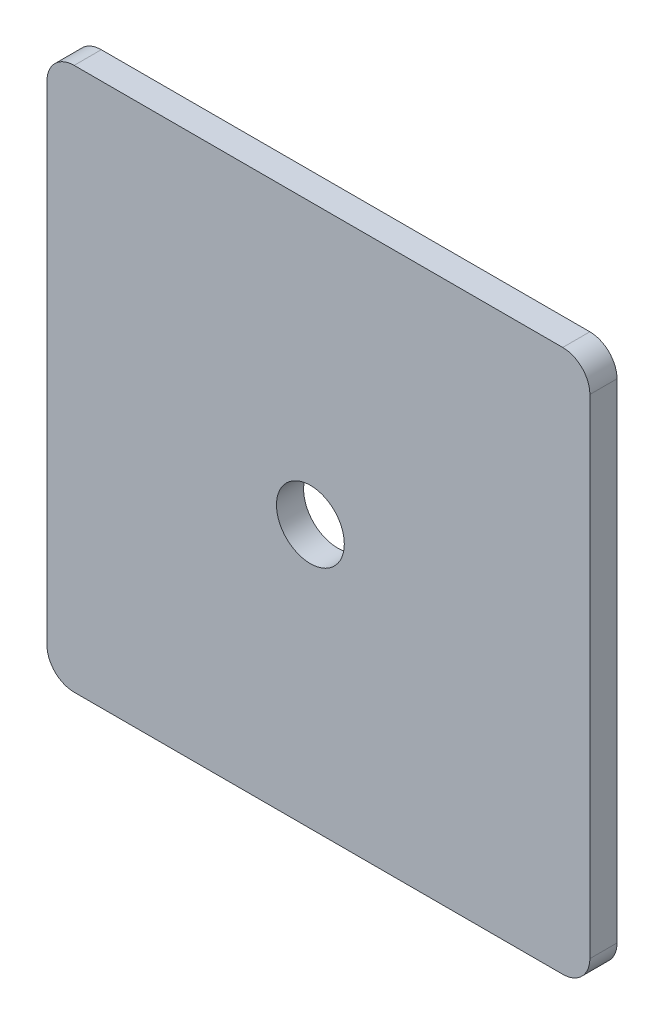
ISO-10303-21;
HEADER;
FILE_DESCRIPTION(('STEP AP214'),'2;1');
FILE_NAME('part.step','',(''),(''),'','','');
FILE_SCHEMA(('AUTOMOTIVE_DESIGN { 1 0 10303 214 1 1 1 1 }'));
ENDSEC;
DATA;
#1=APPLICATION_CONTEXT('core data for automotive mechanical design processes');
#2=APPLICATION_PROTOCOL_DEFINITION('international standard','automotive_design',2000,#1);
#3=PRODUCT_CONTEXT('',#1,'mechanical');
#4=PRODUCT('Part','Part','',(#3));
#5=PRODUCT_RELATED_PRODUCT_CATEGORY('part','',(#4));
#6=PRODUCT_DEFINITION_FORMATION('','',#4);
#7=PRODUCT_DEFINITION_CONTEXT('part definition',#1,'design');
#8=PRODUCT_DEFINITION('design','',#6,#7);
#9=PRODUCT_DEFINITION_SHAPE('','',#8);
#10=(LENGTH_UNIT() NAMED_UNIT(*) SI_UNIT(.MILLI.,.METRE.));
#11=(NAMED_UNIT(*) PLANE_ANGLE_UNIT() SI_UNIT($,.RADIAN.));
#12=(NAMED_UNIT(*) SI_UNIT($,.STERADIAN.) SOLID_ANGLE_UNIT());
#13=UNCERTAINTY_MEASURE_WITH_UNIT(LENGTH_MEASURE(1.E-05),#10,'distance_accuracy_value','');
#14=(GEOMETRIC_REPRESENTATION_CONTEXT(3) GLOBAL_UNCERTAINTY_ASSIGNED_CONTEXT((#13)) GLOBAL_UNIT_ASSIGNED_CONTEXT((#10,
#11,#12)) REPRESENTATION_CONTEXT('',''));
#15=CARTESIAN_POINT('',(0.,0.,0.));
#16=DIRECTION('',(0.,0.,1.));
#17=DIRECTION('',(1.,0.,0.));
#18=AXIS2_PLACEMENT_3D('',#15,#16,#17);
#19=CARTESIAN_POINT('',(-90.,-90.,10.));
#20=DIRECTION('',(0.,0.,-1.));
#21=DIRECTION('',(-1.,0.,0.));
#22=AXIS2_PLACEMENT_3D('',#19,#20,#21);
#23=PLANE('',#22);
#24=CARTESIAN_POINT('',(-90.,-90.,10.));
#25=DIRECTION('',(0.,0.,1.));
#26=DIRECTION('',(-1.,0.,0.));
#27=AXIS2_PLACEMENT_3D('',#24,#25,#26);
#28=CIRCLE('',#27,9.99999999999999);
#29=CARTESIAN_POINT('',(-100.,-89.9999999999999,10.));
#30=VERTEX_POINT('',#29);
#31=CARTESIAN_POINT('',(-89.9999999999999,-100.,10.));
#32=VERTEX_POINT('',#31);
#33=EDGE_CURVE('E145',#30,#32,#28,.T.);
#34=ORIENTED_EDGE('',*,*,#33,.T.);
#35=DIRECTION('',(1.,0.,0.));
#36=VECTOR('',#35,1.);
#37=CARTESIAN_POINT('',(-89.9999999999999,-100.,10.));
#38=LINE('',#37,#36);
#39=CARTESIAN_POINT('',(89.9999999999999,-100.,10.));
#40=VERTEX_POINT('',#39);
#41=EDGE_CURVE('E93',#32,#40,#38,.T.);
#42=ORIENTED_EDGE('',*,*,#41,.T.);
#43=CARTESIAN_POINT('',(90.,-90.,10.));
#44=DIRECTION('',(0.,0.,1.));
#45=DIRECTION('',(1.,0.,0.));
#46=AXIS2_PLACEMENT_3D('',#43,#44,#45);
#47=CIRCLE('',#46,9.99999999999999);
#48=CARTESIAN_POINT('',(100.,-89.9999999999999,10.));
#49=VERTEX_POINT('',#48);
#50=EDGE_CURVE('E160',#40,#49,#47,.T.);
#51=ORIENTED_EDGE('',*,*,#50,.T.);
#52=DIRECTION('',(0.,1.,0.));
#53=VECTOR('',#52,1.);
#54=CARTESIAN_POINT('',(100.,-89.9999999999999,10.));
#55=LINE('',#54,#53);
#56=CARTESIAN_POINT('',(100.,89.9999999999999,10.));
#57=VERTEX_POINT('',#56);
#58=EDGE_CURVE('E173',#49,#57,#55,.T.);
#59=ORIENTED_EDGE('',*,*,#58,.T.);
#60=CARTESIAN_POINT('',(90.,90.,10.));
#61=DIRECTION('',(0.,0.,1.));
#62=DIRECTION('',(1.,0.,0.));
#63=AXIS2_PLACEMENT_3D('',#60,#61,#62);
#64=CIRCLE('',#63,9.99999999999999);
#65=CARTESIAN_POINT('',(89.9999999999999,100.,10.));
#66=VERTEX_POINT('',#65);
#67=EDGE_CURVE('E112',#57,#66,#64,.T.);
#68=ORIENTED_EDGE('',*,*,#67,.T.);
#69=DIRECTION('',(-1.,0.,0.));
#70=VECTOR('',#69,1.);
#71=CARTESIAN_POINT('',(-89.9999999999999,100.,10.));
#72=LINE('',#71,#70);
#73=CARTESIAN_POINT('',(-89.9999999999999,100.,10.));
#74=VERTEX_POINT('',#73);
#75=EDGE_CURVE('E106',#66,#74,#72,.T.);
#76=ORIENTED_EDGE('',*,*,#75,.T.);
#77=CARTESIAN_POINT('',(-90.,90.,10.));
#78=DIRECTION('',(0.,0.,1.));
#79=DIRECTION('',(1.,0.,0.));
#80=AXIS2_PLACEMENT_3D('',#77,#78,#79);
#81=CIRCLE('',#80,9.99999999999999);
#82=CARTESIAN_POINT('',(-100.,89.9999999999999,10.));
#83=VERTEX_POINT('',#82);
#84=EDGE_CURVE('E110',#74,#83,#81,.T.);
#85=ORIENTED_EDGE('',*,*,#84,.T.);
#86=DIRECTION('',(0.,-1.,0.));
#87=VECTOR('',#86,1.);
#88=CARTESIAN_POINT('',(-100.,-89.9999999999999,10.));
#89=LINE('',#88,#87);
#90=EDGE_CURVE('E50',#83,#30,#89,.T.);
#91=ORIENTED_EDGE('',*,*,#90,.T.);
#92=EDGE_LOOP('',(#34,#42,#51,#59,#68,#76,#85,#91));
#93=FACE_BOUND('',#92,.T.);
#94=CARTESIAN_POINT('',(-2.96372974284509,-2.96372974284508,10.));
#95=DIRECTION('',(0.,0.,1.));
#96=DIRECTION('',(1.,0.,0.));
#97=AXIS2_PLACEMENT_3D('',#94,#95,#96);
#98=CIRCLE('',#97,12.5);
#99=CARTESIAN_POINT('',(9.53627025715492,-2.96372974284508,10.));
#100=VERTEX_POINT('',#99);
#101=EDGE_CURVE('E134',#100,#100,#98,.T.);
#102=ORIENTED_EDGE('',*,*,#101,.F.);
#103=EDGE_LOOP('',(#102));
#104=FACE_BOUND('',#103,.T.);
#105=ADVANCED_FACE('F33',(#93,#104),#23,.F.);
#106=CARTESIAN_POINT('',(-90.,-90.,0.));
#107=DIRECTION('',(0.,0.,-1.));
#108=DIRECTION('',(-1.,0.,0.));
#109=AXIS2_PLACEMENT_3D('',#106,#107,#108);
#110=PLANE('',#109);
#111=CARTESIAN_POINT('',(-90.,-90.,0.));
#112=DIRECTION('',(0.,0.,1.));
#113=DIRECTION('',(-1.,0.,0.));
#114=AXIS2_PLACEMENT_3D('',#111,#112,#113);
#115=CIRCLE('',#114,9.99999999999999);
#116=CARTESIAN_POINT('',(-100.,-89.9999999999999,0.));
#117=VERTEX_POINT('',#116);
#118=CARTESIAN_POINT('',(-89.9999999999999,-100.,0.));
#119=VERTEX_POINT('',#118);
#120=EDGE_CURVE('E130',#117,#119,#115,.T.);
#121=ORIENTED_EDGE('',*,*,#120,.F.);
#122=DIRECTION('',(0.,-1.,0.));
#123=VECTOR('',#122,1.);
#124=CARTESIAN_POINT('',(-100.,-89.9999999999999,0.));
#125=LINE('',#124,#123);
#126=CARTESIAN_POINT('',(-100.,89.9999999999999,0.));
#127=VERTEX_POINT('',#126);
#128=EDGE_CURVE('E85',#127,#117,#125,.T.);
#129=ORIENTED_EDGE('',*,*,#128,.F.);
#130=CARTESIAN_POINT('',(-90.,90.,0.));
#131=DIRECTION('',(0.,0.,1.));
#132=DIRECTION('',(1.,0.,0.));
#133=AXIS2_PLACEMENT_3D('',#130,#131,#132);
#134=CIRCLE('',#133,9.99999999999999);
#135=CARTESIAN_POINT('',(-89.9999999999999,100.,0.));
#136=VERTEX_POINT('',#135);
#137=EDGE_CURVE('E79',#136,#127,#134,.T.);
#138=ORIENTED_EDGE('',*,*,#137,.F.);
#139=DIRECTION('',(-1.,0.,0.));
#140=VECTOR('',#139,1.);
#141=CARTESIAN_POINT('',(-89.9999999999999,100.,0.));
#142=LINE('',#141,#140);
#143=CARTESIAN_POINT('',(89.9999999999999,100.,0.));
#144=VERTEX_POINT('',#143);
#145=EDGE_CURVE('E120',#144,#136,#142,.T.);
#146=ORIENTED_EDGE('',*,*,#145,.F.);
#147=CARTESIAN_POINT('',(90.,90.,0.));
#148=DIRECTION('',(0.,0.,1.));
#149=DIRECTION('',(1.,0.,0.));
#150=AXIS2_PLACEMENT_3D('',#147,#148,#149);
#151=CIRCLE('',#150,9.99999999999999);
#152=CARTESIAN_POINT('',(100.,89.9999999999999,0.));
#153=VERTEX_POINT('',#152);
#154=EDGE_CURVE('E140',#153,#144,#151,.T.);
#155=ORIENTED_EDGE('',*,*,#154,.F.);
#156=DIRECTION('',(0.,1.,0.));
#157=VECTOR('',#156,1.);
#158=CARTESIAN_POINT('',(100.,-89.9999999999999,0.));
#159=LINE('',#158,#157);
#160=CARTESIAN_POINT('',(100.,-89.9999999999999,0.));
#161=VERTEX_POINT('',#160);
#162=EDGE_CURVE('E138',#161,#153,#159,.T.);
#163=ORIENTED_EDGE('',*,*,#162,.F.);
#164=CARTESIAN_POINT('',(90.,-90.,0.));
#165=DIRECTION('',(0.,0.,1.));
#166=DIRECTION('',(1.,0.,0.));
#167=AXIS2_PLACEMENT_3D('',#164,#165,#166);
#168=CIRCLE('',#167,9.99999999999999);
#169=CARTESIAN_POINT('',(89.9999999999999,-100.,0.));
#170=VERTEX_POINT('',#169);
#171=EDGE_CURVE('E136',#170,#161,#168,.T.);
#172=ORIENTED_EDGE('',*,*,#171,.F.);
#173=DIRECTION('',(1.,0.,0.));
#174=VECTOR('',#173,1.);
#175=CARTESIAN_POINT('',(-89.9999999999999,-100.,0.));
#176=LINE('',#175,#174);
#177=EDGE_CURVE('E133',#119,#170,#176,.T.);
#178=ORIENTED_EDGE('',*,*,#177,.F.);
#179=EDGE_LOOP('',(#121,#129,#138,#146,#155,#163,#172,#178));
#180=FACE_BOUND('',#179,.T.);
#181=CARTESIAN_POINT('',(-2.96372974284509,-2.96372974284508,0.));
#182=DIRECTION('',(0.,0.,1.));
#183=DIRECTION('',(1.,0.,0.));
#184=AXIS2_PLACEMENT_3D('',#181,#182,#183);
#185=CIRCLE('',#184,12.5);
#186=CARTESIAN_POINT('',(9.53627025715492,-2.96372974284508,0.));
#187=VERTEX_POINT('',#186);
#188=EDGE_CURVE('E179',#187,#187,#185,.T.);
#189=ORIENTED_EDGE('',*,*,#188,.T.);
#190=EDGE_LOOP('',(#189));
#191=FACE_BOUND('',#190,.T.);
#192=ADVANCED_FACE('F164',(#180,#191),#110,.T.);
#193=CARTESIAN_POINT('',(-90.,-90.,10.));
#194=DIRECTION('',(0.,0.,-1.));
#195=DIRECTION('',(-1.,0.,0.));
#196=AXIS2_PLACEMENT_3D('',#193,#194,#195);
#197=CYLINDRICAL_SURFACE('',#196,9.99999999999999);
#198=ORIENTED_EDGE('',*,*,#120,.T.);
#199=DIRECTION('',(0.,0.,-1.));
#200=VECTOR('',#199,1.);
#201=CARTESIAN_POINT('',(-89.9999999999999,-100.,10.));
#202=LINE('',#201,#200);
#203=EDGE_CURVE('E11',#32,#119,#202,.T.);
#204=ORIENTED_EDGE('',*,*,#203,.F.);
#205=ORIENTED_EDGE('',*,*,#33,.F.);
#206=DIRECTION('',(0.,0.,-1.));
#207=VECTOR('',#206,1.);
#208=CARTESIAN_POINT('',(-100.,-89.9999999999999,10.));
#209=LINE('',#208,#207);
#210=EDGE_CURVE('E126',#30,#117,#209,.T.);
#211=ORIENTED_EDGE('',*,*,#210,.T.);
#212=EDGE_LOOP('',(#198,#204,#205,#211));
#213=FACE_BOUND('',#212,.T.);
#214=ADVANCED_FACE('F35',(#213),#197,.T.);
#215=CARTESIAN_POINT('',(-89.9999999999999,-100.,10.));
#216=DIRECTION('',(0.,1.,0.));
#217=DIRECTION('',(0.,0.,1.));
#218=AXIS2_PLACEMENT_3D('',#215,#216,#217);
#219=PLANE('',#218);
#220=ORIENTED_EDGE('',*,*,#177,.T.);
#221=DIRECTION('',(0.,0.,-1.));
#222=VECTOR('',#221,1.);
#223=CARTESIAN_POINT('',(89.9999999999999,-100.,10.));
#224=LINE('',#223,#222);
#225=EDGE_CURVE('E42',#40,#170,#224,.T.);
#226=ORIENTED_EDGE('',*,*,#225,.F.);
#227=ORIENTED_EDGE('',*,*,#41,.F.);
#228=ORIENTED_EDGE('',*,*,#203,.T.);
#229=EDGE_LOOP('',(#220,#226,#227,#228));
#230=FACE_BOUND('',#229,.T.);
#231=ADVANCED_FACE('F207',(#230),#219,.F.);
#232=CARTESIAN_POINT('',(90.,-90.,10.));
#233=DIRECTION('',(0.,0.,-1.));
#234=DIRECTION('',(-1.,0.,0.));
#235=AXIS2_PLACEMENT_3D('',#232,#233,#234);
#236=CYLINDRICAL_SURFACE('',#235,9.99999999999999);
#237=ORIENTED_EDGE('',*,*,#171,.T.);
#238=DIRECTION('',(0.,0.,-1.));
#239=VECTOR('',#238,1.);
#240=CARTESIAN_POINT('',(100.,-89.9999999999999,10.));
#241=LINE('',#240,#239);
#242=EDGE_CURVE('E152',#49,#161,#241,.T.);
#243=ORIENTED_EDGE('',*,*,#242,.F.);
#244=ORIENTED_EDGE('',*,*,#50,.F.);
#245=ORIENTED_EDGE('',*,*,#225,.T.);
#246=EDGE_LOOP('',(#237,#243,#244,#245));
#247=FACE_BOUND('',#246,.T.);
#248=ADVANCED_FACE('F158',(#247),#236,.T.);
#249=CARTESIAN_POINT('',(100.,-89.9999999999999,10.));
#250=DIRECTION('',(-1.,0.,0.));
#251=DIRECTION('',(0.,0.,1.));
#252=AXIS2_PLACEMENT_3D('',#249,#250,#251);
#253=PLANE('',#252);
#254=ORIENTED_EDGE('',*,*,#162,.T.);
#255=DIRECTION('',(0.,0.,-1.));
#256=VECTOR('',#255,1.);
#257=CARTESIAN_POINT('',(100.,89.9999999999999,10.));
#258=LINE('',#257,#256);
#259=EDGE_CURVE('E149',#57,#153,#258,.T.);
#260=ORIENTED_EDGE('',*,*,#259,.F.);
#261=ORIENTED_EDGE('',*,*,#58,.F.);
#262=ORIENTED_EDGE('',*,*,#242,.T.);
#263=EDGE_LOOP('',(#254,#260,#261,#262));
#264=FACE_BOUND('',#263,.T.);
#265=ADVANCED_FACE('F169',(#264),#253,.F.);
#266=CARTESIAN_POINT('',(90.,90.,10.));
#267=DIRECTION('',(0.,0.,-1.));
#268=DIRECTION('',(-1.,0.,0.));
#269=AXIS2_PLACEMENT_3D('',#266,#267,#268);
#270=CYLINDRICAL_SURFACE('',#269,9.99999999999999);
#271=ORIENTED_EDGE('',*,*,#154,.T.);
#272=DIRECTION('',(0.,0.,-1.));
#273=VECTOR('',#272,1.);
#274=CARTESIAN_POINT('',(89.9999999999999,100.,10.));
#275=LINE('',#274,#273);
#276=EDGE_CURVE('E121',#66,#144,#275,.T.);
#277=ORIENTED_EDGE('',*,*,#276,.F.);
#278=ORIENTED_EDGE('',*,*,#67,.F.);
#279=ORIENTED_EDGE('',*,*,#259,.T.);
#280=EDGE_LOOP('',(#271,#277,#278,#279));
#281=FACE_BOUND('',#280,.T.);
#282=ADVANCED_FACE('F172',(#281),#270,.T.);
#283=CARTESIAN_POINT('',(-89.9999999999999,100.,10.));
#284=DIRECTION('',(0.,-1.,0.));
#285=DIRECTION('',(0.,0.,-1.));
#286=AXIS2_PLACEMENT_3D('',#283,#284,#285);
#287=PLANE('',#286);
#288=ORIENTED_EDGE('',*,*,#145,.T.);
#289=DIRECTION('',(0.,0.,-1.));
#290=VECTOR('',#289,1.);
#291=CARTESIAN_POINT('',(-89.9999999999999,100.,10.));
#292=LINE('',#291,#290);
#293=EDGE_CURVE('E117',#74,#136,#292,.T.);
#294=ORIENTED_EDGE('',*,*,#293,.F.);
#295=ORIENTED_EDGE('',*,*,#75,.F.);
#296=ORIENTED_EDGE('',*,*,#276,.T.);
#297=EDGE_LOOP('',(#288,#294,#295,#296));
#298=FACE_BOUND('',#297,.T.);
#299=ADVANCED_FACE('F118',(#298),#287,.F.);
#300=CARTESIAN_POINT('',(-90.,90.,10.));
#301=DIRECTION('',(0.,0.,-1.));
#302=DIRECTION('',(-1.,0.,0.));
#303=AXIS2_PLACEMENT_3D('',#300,#301,#302);
#304=CYLINDRICAL_SURFACE('',#303,9.99999999999999);
#305=ORIENTED_EDGE('',*,*,#137,.T.);
#306=DIRECTION('',(0.,0.,-1.));
#307=VECTOR('',#306,1.);
#308=CARTESIAN_POINT('',(-100.,89.9999999999999,10.));
#309=LINE('',#308,#307);
#310=EDGE_CURVE('E122',#83,#127,#309,.T.);
#311=ORIENTED_EDGE('',*,*,#310,.F.);
#312=ORIENTED_EDGE('',*,*,#84,.F.);
#313=ORIENTED_EDGE('',*,*,#293,.T.);
#314=EDGE_LOOP('',(#305,#311,#312,#313));
#315=FACE_BOUND('',#314,.T.);
#316=ADVANCED_FACE('F124',(#315),#304,.T.);
#317=CARTESIAN_POINT('',(-100.,-89.9999999999999,10.));
#318=DIRECTION('',(1.,0.,0.));
#319=DIRECTION('',(0.,0.,-1.));
#320=AXIS2_PLACEMENT_3D('',#317,#318,#319);
#321=PLANE('',#320);
#322=ORIENTED_EDGE('',*,*,#128,.T.);
#323=ORIENTED_EDGE('',*,*,#210,.F.);
#324=ORIENTED_EDGE('',*,*,#90,.F.);
#325=ORIENTED_EDGE('',*,*,#310,.T.);
#326=EDGE_LOOP('',(#322,#323,#324,#325));
#327=FACE_BOUND('',#326,.T.);
#328=ADVANCED_FACE('F195',(#327),#321,.F.);
#329=CARTESIAN_POINT('',(-2.96372974284509,-2.96372974284508,10.));
#330=DIRECTION('',(0.,0.,-1.));
#331=DIRECTION('',(-1.,0.,0.));
#332=AXIS2_PLACEMENT_3D('',#329,#330,#331);
#333=CYLINDRICAL_SURFACE('',#332,12.5);
#334=ORIENTED_EDGE('',*,*,#101,.T.);
#335=EDGE_LOOP('',(#334));
#336=FACE_BOUND('',#335,.T.);
#337=ORIENTED_EDGE('',*,*,#188,.F.);
#338=EDGE_LOOP('',(#337));
#339=FACE_BOUND('',#338,.T.);
#340=ADVANCED_FACE('F185',(#336,#339),#333,.F.);
#341=CLOSED_SHELL('',(#105,#192,#214,#231,#248,#265,#282,#299,#316,#328,#340));
#342=MANIFOLD_SOLID_BREP('B2',#341);
#343=ADVANCED_BREP_SHAPE_REPRESENTATION('',(#18,#342),#14);
#344=SHAPE_DEFINITION_REPRESENTATION(#9,#343);
ENDSEC;
END-ISO-10303-21;
